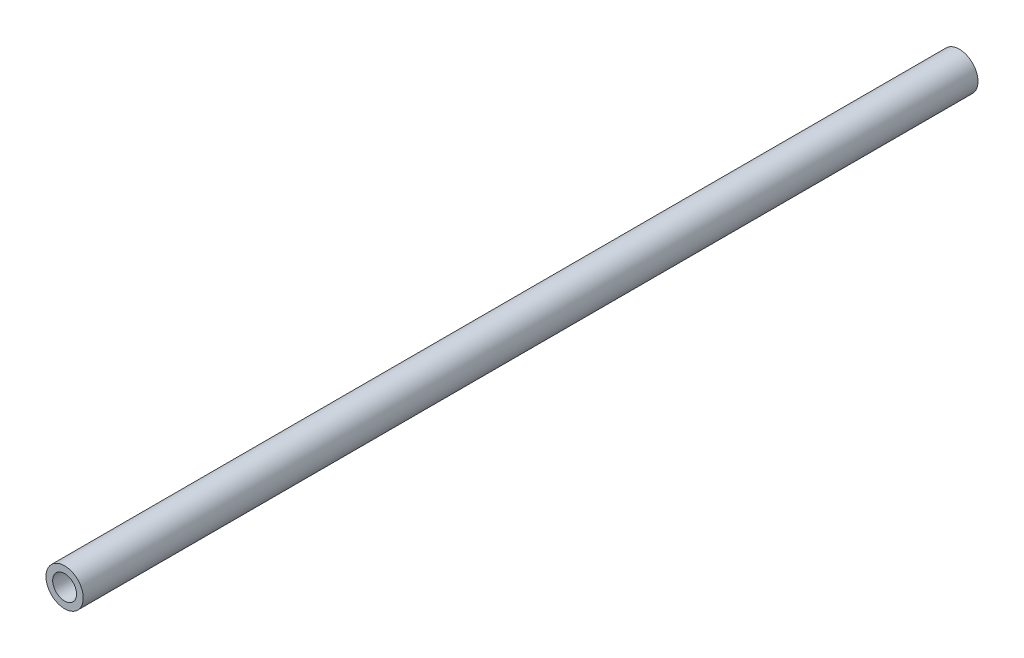
ISO-10303-21;
HEADER;
FILE_DESCRIPTION(('STEP AP214'),'2;1');
FILE_NAME('part.step','',(''),(''),'','','');
FILE_SCHEMA(('AUTOMOTIVE_DESIGN { 1 0 10303 214 1 1 1 1 }'));
ENDSEC;
DATA;
#1=APPLICATION_CONTEXT('core data for automotive mechanical design processes');
#2=APPLICATION_PROTOCOL_DEFINITION('international standard','automotive_design',2000,#1);
#3=PRODUCT_CONTEXT('',#1,'mechanical');
#4=PRODUCT('Part','Part','',(#3));
#5=PRODUCT_RELATED_PRODUCT_CATEGORY('part','',(#4));
#6=PRODUCT_DEFINITION_FORMATION('','',#4);
#7=PRODUCT_DEFINITION_CONTEXT('part definition',#1,'design');
#8=PRODUCT_DEFINITION('design','',#6,#7);
#9=PRODUCT_DEFINITION_SHAPE('','',#8);
#10=(LENGTH_UNIT() NAMED_UNIT(*) SI_UNIT(.MILLI.,.METRE.));
#11=(NAMED_UNIT(*) PLANE_ANGLE_UNIT() SI_UNIT($,.RADIAN.));
#12=(NAMED_UNIT(*) SI_UNIT($,.STERADIAN.) SOLID_ANGLE_UNIT());
#13=UNCERTAINTY_MEASURE_WITH_UNIT(LENGTH_MEASURE(1.E-05),#10,'distance_accuracy_value','');
#14=(GEOMETRIC_REPRESENTATION_CONTEXT(3) GLOBAL_UNCERTAINTY_ASSIGNED_CONTEXT((#13)) GLOBAL_UNIT_ASSIGNED_CONTEXT((#10,
#11,#12)) REPRESENTATION_CONTEXT('',''));
#15=CARTESIAN_POINT('',(0.,0.,0.));
#16=DIRECTION('',(0.,0.,1.));
#17=DIRECTION('',(1.,0.,0.));
#18=AXIS2_PLACEMENT_3D('',#15,#16,#17);
#19=CARTESIAN_POINT('',(0.,0.,60.));
#20=DIRECTION('',(0.,0.,1.));
#21=DIRECTION('',(1.,0.,0.));
#22=AXIS2_PLACEMENT_3D('',#19,#20,#21);
#23=PLANE('',#22);
#24=CARTESIAN_POINT('',(0.,0.,60.));
#25=DIRECTION('',(0.,0.,1.));
#26=DIRECTION('',(1.,0.,0.));
#27=AXIS2_PLACEMENT_3D('',#24,#25,#26);
#28=CIRCLE('',#27,2.5);
#29=CARTESIAN_POINT('',(2.5,0.,60.));
#30=VERTEX_POINT('',#29);
#31=EDGE_CURVE('E10',#30,#30,#28,.T.);
#32=ORIENTED_EDGE('',*,*,#31,.T.);
#33=EDGE_LOOP('',(#32));
#34=FACE_BOUND('',#33,.T.);
#35=CARTESIAN_POINT('',(0.,0.,60.));
#36=DIRECTION('',(0.,0.,1.));
#37=DIRECTION('',(1.,0.,0.));
#38=AXIS2_PLACEMENT_3D('',#35,#36,#37);
#39=CIRCLE('',#38,1.6);
#40=CARTESIAN_POINT('',(1.6,0.,60.));
#41=VERTEX_POINT('',#40);
#42=EDGE_CURVE('E45',#41,#41,#39,.T.);
#43=ORIENTED_EDGE('',*,*,#42,.F.);
#44=EDGE_LOOP('',(#43));
#45=FACE_BOUND('',#44,.T.);
#46=ADVANCED_FACE('F34',(#34,#45),#23,.T.);
#47=CARTESIAN_POINT('',(0.,0.,-60.));
#48=DIRECTION('',(0.,0.,1.));
#49=DIRECTION('',(1.,0.,0.));
#50=AXIS2_PLACEMENT_3D('',#47,#48,#49);
#51=PLANE('',#50);
#52=CARTESIAN_POINT('',(0.,0.,-60.));
#53=DIRECTION('',(0.,0.,1.));
#54=DIRECTION('',(1.,0.,0.));
#55=AXIS2_PLACEMENT_3D('',#52,#53,#54);
#56=CIRCLE('',#55,2.5);
#57=CARTESIAN_POINT('',(2.5,0.,-60.));
#58=VERTEX_POINT('',#57);
#59=EDGE_CURVE('E38',#58,#58,#56,.T.);
#60=ORIENTED_EDGE('',*,*,#59,.F.);
#61=EDGE_LOOP('',(#60));
#62=FACE_BOUND('',#61,.T.);
#63=CARTESIAN_POINT('',(0.,0.,-60.));
#64=DIRECTION('',(0.,0.,1.));
#65=DIRECTION('',(1.,0.,0.));
#66=AXIS2_PLACEMENT_3D('',#63,#64,#65);
#67=CIRCLE('',#66,1.6);
#68=CARTESIAN_POINT('',(1.6,0.,-60.));
#69=VERTEX_POINT('',#68);
#70=EDGE_CURVE('E47',#69,#69,#67,.T.);
#71=ORIENTED_EDGE('',*,*,#70,.T.);
#72=EDGE_LOOP('',(#71));
#73=FACE_BOUND('',#72,.T.);
#74=ADVANCED_FACE('F57',(#62,#73),#51,.F.);
#75=CARTESIAN_POINT('',(0.,0.,60.));
#76=DIRECTION('',(0.,0.,-1.));
#77=DIRECTION('',(-1.,0.,0.));
#78=AXIS2_PLACEMENT_3D('',#75,#76,#77);
#79=CYLINDRICAL_SURFACE('',#78,2.5);
#80=ORIENTED_EDGE('',*,*,#31,.F.);
#81=EDGE_LOOP('',(#80));
#82=FACE_BOUND('',#81,.T.);
#83=ORIENTED_EDGE('',*,*,#59,.T.);
#84=EDGE_LOOP('',(#83));
#85=FACE_BOUND('',#84,.T.);
#86=ADVANCED_FACE('F36',(#82,#85),#79,.T.);
#87=CARTESIAN_POINT('',(0.,0.,60.));
#88=DIRECTION('',(0.,0.,-1.));
#89=DIRECTION('',(-1.,0.,0.));
#90=AXIS2_PLACEMENT_3D('',#87,#88,#89);
#91=CYLINDRICAL_SURFACE('',#90,1.6);
#92=ORIENTED_EDGE('',*,*,#42,.T.);
#93=EDGE_LOOP('',(#92));
#94=FACE_BOUND('',#93,.T.);
#95=ORIENTED_EDGE('',*,*,#70,.F.);
#96=EDGE_LOOP('',(#95));
#97=FACE_BOUND('',#96,.T.);
#98=ADVANCED_FACE('F53',(#94,#97),#91,.F.);
#99=CLOSED_SHELL('',(#46,#74,#86,#98));
#100=MANIFOLD_SOLID_BREP('B2',#99);
#101=ADVANCED_BREP_SHAPE_REPRESENTATION('',(#18,#100),#14);
#102=SHAPE_DEFINITION_REPRESENTATION(#9,#101);
ENDSEC;
END-ISO-10303-21;
